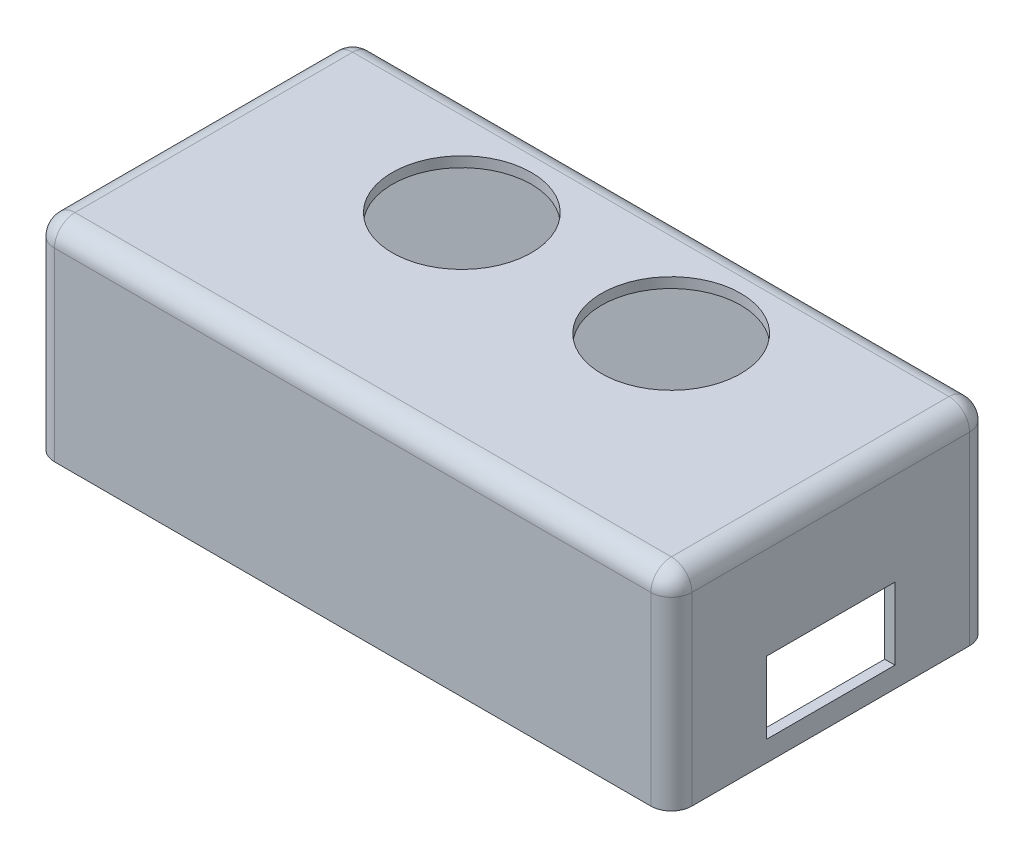
ISO-10303-21;
HEADER;
FILE_DESCRIPTION(('STEP AP214'),'2;1');
FILE_NAME('part.step','',(''),(''),'','','');
FILE_SCHEMA(('AUTOMOTIVE_DESIGN { 1 0 10303 214 1 1 1 1 }'));
ENDSEC;
DATA;
#1=APPLICATION_CONTEXT('core data for automotive mechanical design processes');
#2=APPLICATION_PROTOCOL_DEFINITION('international standard','automotive_design',2000,#1);
#3=PRODUCT_CONTEXT('',#1,'mechanical');
#4=PRODUCT('Part','Part','',(#3));
#5=PRODUCT_RELATED_PRODUCT_CATEGORY('part','',(#4));
#6=PRODUCT_DEFINITION_FORMATION('','',#4);
#7=PRODUCT_DEFINITION_CONTEXT('part definition',#1,'design');
#8=PRODUCT_DEFINITION('design','',#6,#7);
#9=PRODUCT_DEFINITION_SHAPE('','',#8);
#10=(LENGTH_UNIT() NAMED_UNIT(*) SI_UNIT(.MILLI.,.METRE.));
#11=(NAMED_UNIT(*) PLANE_ANGLE_UNIT() SI_UNIT($,.RADIAN.));
#12=(NAMED_UNIT(*) SI_UNIT($,.STERADIAN.) SOLID_ANGLE_UNIT());
#13=UNCERTAINTY_MEASURE_WITH_UNIT(LENGTH_MEASURE(1.E-05),#10,'distance_accuracy_value','');
#14=(GEOMETRIC_REPRESENTATION_CONTEXT(3) GLOBAL_UNCERTAINTY_ASSIGNED_CONTEXT((#13)) GLOBAL_UNIT_ASSIGNED_CONTEXT((#10,
#11,#12)) REPRESENTATION_CONTEXT('',''));
#15=CARTESIAN_POINT('',(0.,0.,0.));
#16=DIRECTION('',(0.,0.,1.));
#17=DIRECTION('',(1.,0.,0.));
#18=AXIS2_PLACEMENT_3D('',#15,#16,#17);
#19=CARTESIAN_POINT('',(0.,0.,0.));
#20=DIRECTION('',(0.,1.,0.));
#21=DIRECTION('',(0.,0.,1.));
#22=AXIS2_PLACEMENT_3D('',#19,#20,#21);
#23=PLANE('',#22);
#24=DIRECTION('',(0.,0.,1.));
#25=VECTOR('',#24,1.);
#26=CARTESIAN_POINT('',(-78.74,0.,0.));
#27=LINE('',#26,#25);
#28=CARTESIAN_POINT('',(-78.74,0.,-36.83));
#29=VERTEX_POINT('',#28);
#30=CARTESIAN_POINT('',(-78.74,0.,-2.53999999999999));
#31=VERTEX_POINT('',#30);
#32=EDGE_CURVE('E345',#29,#31,#27,.T.);
#33=ORIENTED_EDGE('',*,*,#32,.F.);
#34=CARTESIAN_POINT('',(-76.2,0.,-36.83));
#35=DIRECTION('',(0.,1.,0.));
#36=DIRECTION('',(0.,0.,1.));
#37=AXIS2_PLACEMENT_3D('',#34,#35,#36);
#38=CIRCLE('',#37,2.54);
#39=CARTESIAN_POINT('',(-76.2,0.,-39.37));
#40=VERTEX_POINT('',#39);
#41=EDGE_CURVE('E12',#29,#40,#38,.F.);
#42=ORIENTED_EDGE('',*,*,#41,.T.);
#43=DIRECTION('',(-1.,0.,0.));
#44=VECTOR('',#43,1.);
#45=CARTESIAN_POINT('',(0.,0.,-39.37));
#46=LINE('',#45,#44);
#47=CARTESIAN_POINT('',(-2.54,0.,-39.37));
#48=VERTEX_POINT('',#47);
#49=EDGE_CURVE('E342',#48,#40,#46,.T.);
#50=ORIENTED_EDGE('',*,*,#49,.F.);
#51=CARTESIAN_POINT('',(-2.54,0.,-36.83));
#52=DIRECTION('',(0.,1.,0.));
#53=DIRECTION('',(0.,0.,1.));
#54=AXIS2_PLACEMENT_3D('',#51,#52,#53);
#55=CIRCLE('',#54,2.54);
#56=CARTESIAN_POINT('',(0.,0.,-36.83));
#57=VERTEX_POINT('',#56);
#58=EDGE_CURVE('E385',#48,#57,#55,.F.);
#59=ORIENTED_EDGE('',*,*,#58,.T.);
#60=DIRECTION('',(0.,0.,-1.));
#61=VECTOR('',#60,1.);
#62=CARTESIAN_POINT('',(0.,0.,0.));
#63=LINE('',#62,#61);
#64=CARTESIAN_POINT('',(0.,0.,-2.54));
#65=VERTEX_POINT('',#64);
#66=EDGE_CURVE('E339',#65,#57,#63,.T.);
#67=ORIENTED_EDGE('',*,*,#66,.F.);
#68=CARTESIAN_POINT('',(-2.54,0.,-2.54));
#69=DIRECTION('',(0.,1.,0.));
#70=DIRECTION('',(0.,0.,1.));
#71=AXIS2_PLACEMENT_3D('',#68,#69,#70);
#72=CIRCLE('',#71,2.54);
#73=CARTESIAN_POINT('',(-2.54,0.,0.));
#74=VERTEX_POINT('',#73);
#75=EDGE_CURVE('E387',#65,#74,#72,.F.);
#76=ORIENTED_EDGE('',*,*,#75,.T.);
#77=DIRECTION('',(1.,0.,0.));
#78=VECTOR('',#77,1.);
#79=CARTESIAN_POINT('',(0.,0.,0.));
#80=LINE('',#79,#78);
#81=CARTESIAN_POINT('',(-76.2,0.,0.));
#82=VERTEX_POINT('',#81);
#83=EDGE_CURVE('E348',#82,#74,#80,.T.);
#84=ORIENTED_EDGE('',*,*,#83,.F.);
#85=CARTESIAN_POINT('',(-76.2,0.,-2.53999999999999));
#86=DIRECTION('',(0.,1.,0.));
#87=DIRECTION('',(0.,0.,1.));
#88=AXIS2_PLACEMENT_3D('',#85,#86,#87);
#89=CIRCLE('',#88,2.54);
#90=EDGE_CURVE('E47',#82,#31,#89,.F.);
#91=ORIENTED_EDGE('',*,*,#90,.T.);
#92=EDGE_LOOP('',(#33,#42,#50,#59,#67,#76,#84,#91));
#93=FACE_BOUND('',#92,.T.);
#94=CARTESIAN_POINT('',(-76.2,0.,-36.83));
#95=DIRECTION('',(0.,1.,0.));
#96=DIRECTION('',(0.,0.,1.));
#97=AXIS2_PLACEMENT_3D('',#94,#95,#96);
#98=CIRCLE('',#97,1.27);
#99=CARTESIAN_POINT('',(-77.47,0.,-36.83));
#100=VERTEX_POINT('',#99);
#101=CARTESIAN_POINT('',(-76.2,0.,-38.1));
#102=VERTEX_POINT('',#101);
#103=EDGE_CURVE('E331',#100,#102,#98,.F.);
#104=ORIENTED_EDGE('',*,*,#103,.F.);
#105=DIRECTION('',(0.,0.,1.));
#106=VECTOR('',#105,1.);
#107=CARTESIAN_POINT('',(-77.47,0.,0.));
#108=LINE('',#107,#106);
#109=CARTESIAN_POINT('',(-77.47,0.,-2.53999999999999));
#110=VERTEX_POINT('',#109);
#111=EDGE_CURVE('E329',#100,#110,#108,.T.);
#112=ORIENTED_EDGE('',*,*,#111,.T.);
#113=CARTESIAN_POINT('',(-76.2,0.,-2.53999999999999));
#114=DIRECTION('',(0.,1.,0.));
#115=DIRECTION('',(0.,0.,1.));
#116=AXIS2_PLACEMENT_3D('',#113,#114,#115);
#117=CIRCLE('',#116,1.27);
#118=CARTESIAN_POINT('',(-76.2,0.,-1.26999999999999));
#119=VERTEX_POINT('',#118);
#120=EDGE_CURVE('E326',#119,#110,#117,.F.);
#121=ORIENTED_EDGE('',*,*,#120,.F.);
#122=DIRECTION('',(1.,0.,0.));
#123=VECTOR('',#122,1.);
#124=CARTESIAN_POINT('',(0.,0.,-1.27));
#125=LINE('',#124,#123);
#126=CARTESIAN_POINT('',(-2.54,0.,-1.27));
#127=VERTEX_POINT('',#126);
#128=EDGE_CURVE('E294',#119,#127,#125,.T.);
#129=ORIENTED_EDGE('',*,*,#128,.T.);
#130=CARTESIAN_POINT('',(-2.54,0.,-2.54));
#131=DIRECTION('',(0.,1.,0.));
#132=DIRECTION('',(0.,0.,1.));
#133=AXIS2_PLACEMENT_3D('',#130,#131,#132);
#134=CIRCLE('',#133,1.27);
#135=CARTESIAN_POINT('',(-1.27,0.,-2.54));
#136=VERTEX_POINT('',#135);
#137=EDGE_CURVE('E324',#136,#127,#134,.F.);
#138=ORIENTED_EDGE('',*,*,#137,.F.);
#139=DIRECTION('',(0.,0.,-1.));
#140=VECTOR('',#139,1.);
#141=CARTESIAN_POINT('',(-1.27,0.,0.));
#142=LINE('',#141,#140);
#143=CARTESIAN_POINT('',(-1.27,0.,-36.83));
#144=VERTEX_POINT('',#143);
#145=EDGE_CURVE('E274',#136,#144,#142,.T.);
#146=ORIENTED_EDGE('',*,*,#145,.T.);
#147=CARTESIAN_POINT('',(-2.54,0.,-36.83));
#148=DIRECTION('',(0.,1.,0.));
#149=DIRECTION('',(0.,0.,1.));
#150=AXIS2_PLACEMENT_3D('',#147,#148,#149);
#151=CIRCLE('',#150,1.27);
#152=CARTESIAN_POINT('',(-2.54,0.,-38.1));
#153=VERTEX_POINT('',#152);
#154=EDGE_CURVE('E255',#153,#144,#151,.F.);
#155=ORIENTED_EDGE('',*,*,#154,.F.);
#156=DIRECTION('',(-1.,0.,0.));
#157=VECTOR('',#156,1.);
#158=CARTESIAN_POINT('',(0.,0.,-38.1));
#159=LINE('',#158,#157);
#160=EDGE_CURVE('E323',#153,#102,#159,.T.);
#161=ORIENTED_EDGE('',*,*,#160,.T.);
#162=EDGE_LOOP('',(#104,#112,#121,#129,#138,#146,#155,#161));
#163=FACE_BOUND('',#162,.T.);
#164=ADVANCED_FACE('F38',(#93,#163),#23,.F.);
#165=CARTESIAN_POINT('',(0.,25.4,0.));
#166=DIRECTION('',(-1.,0.,0.));
#167=DIRECTION('',(0.,0.,1.));
#168=AXIS2_PLACEMENT_3D('',#165,#166,#167);
#169=PLANE('',#168);
#170=DIRECTION('',(0.,1.,0.));
#171=VECTOR('',#170,1.);
#172=CARTESIAN_POINT('',(0.,2.54,-27.6225));
#173=LINE('',#172,#171);
#174=CARTESIAN_POINT('',(0.,2.54,-27.6225));
#175=VERTEX_POINT('',#174);
#176=CARTESIAN_POINT('',(0.,11.43,-27.6225));
#177=VERTEX_POINT('',#176);
#178=EDGE_CURVE('E224',#175,#177,#173,.T.);
#179=ORIENTED_EDGE('',*,*,#178,.F.);
#180=DIRECTION('',(0.,0.,-1.));
#181=VECTOR('',#180,1.);
#182=CARTESIAN_POINT('',(0.,2.54,-11.7475));
#183=LINE('',#182,#181);
#184=CARTESIAN_POINT('',(0.,2.54,-11.7475));
#185=VERTEX_POINT('',#184);
#186=EDGE_CURVE('E217',#185,#175,#183,.T.);
#187=ORIENTED_EDGE('',*,*,#186,.F.);
#188=DIRECTION('',(0.,-1.,0.));
#189=VECTOR('',#188,1.);
#190=CARTESIAN_POINT('',(0.,2.54,-11.7475));
#191=LINE('',#190,#189);
#192=CARTESIAN_POINT('',(0.,11.43,-11.7475));
#193=VERTEX_POINT('',#192);
#194=EDGE_CURVE('E228',#193,#185,#191,.T.);
#195=ORIENTED_EDGE('',*,*,#194,.F.);
#196=DIRECTION('',(0.,0.,1.));
#197=VECTOR('',#196,1.);
#198=CARTESIAN_POINT('',(0.,11.43,-11.7475));
#199=LINE('',#198,#197);
#200=EDGE_CURVE('E55',#177,#193,#199,.T.);
#201=ORIENTED_EDGE('',*,*,#200,.F.);
#202=EDGE_LOOP('',(#179,#187,#195,#201));
#203=FACE_BOUND('',#202,.T.);
#204=DIRECTION('',(0.,0.,-1.));
#205=VECTOR('',#204,1.);
#206=CARTESIAN_POINT('',(0.,22.86,0.));
#207=LINE('',#206,#205);
#208=CARTESIAN_POINT('',(0.,22.86,-36.83));
#209=VERTEX_POINT('',#208);
#210=CARTESIAN_POINT('',(0.,22.86,-2.54));
#211=VERTEX_POINT('',#210);
#212=EDGE_CURVE('E381',#209,#211,#207,.F.);
#213=ORIENTED_EDGE('',*,*,#212,.T.);
#214=DIRECTION('',(0.,-1.,0.));
#215=VECTOR('',#214,1.);
#216=CARTESIAN_POINT('',(0.,25.4,-2.54));
#217=LINE('',#216,#215);
#218=EDGE_CURVE('E383',#211,#65,#217,.T.);
#219=ORIENTED_EDGE('',*,*,#218,.T.);
#220=ORIENTED_EDGE('',*,*,#66,.T.);
#221=DIRECTION('',(0.,-1.,0.));
#222=VECTOR('',#221,1.);
#223=CARTESIAN_POINT('',(0.,25.4,-36.83));
#224=LINE('',#223,#222);
#225=EDGE_CURVE('E379',#57,#209,#224,.F.);
#226=ORIENTED_EDGE('',*,*,#225,.T.);
#227=EDGE_LOOP('',(#213,#219,#220,#226));
#228=FACE_BOUND('',#227,.T.);
#229=ADVANCED_FACE('F459',(#203,#228),#169,.F.);
#230=CARTESIAN_POINT('',(0.,25.4,-39.37));
#231=DIRECTION('',(0.,0.,1.));
#232=DIRECTION('',(1.,0.,0.));
#233=AXIS2_PLACEMENT_3D('',#230,#231,#232);
#234=PLANE('',#233);
#235=ORIENTED_EDGE('',*,*,#49,.T.);
#236=DIRECTION('',(0.,-1.,0.));
#237=VECTOR('',#236,1.);
#238=CARTESIAN_POINT('',(-76.2,25.4,-39.37));
#239=LINE('',#238,#237);
#240=CARTESIAN_POINT('',(-76.2,22.86,-39.37));
#241=VERTEX_POINT('',#240);
#242=EDGE_CURVE('E377',#40,#241,#239,.F.);
#243=ORIENTED_EDGE('',*,*,#242,.T.);
#244=DIRECTION('',(-1.,0.,0.));
#245=VECTOR('',#244,1.);
#246=CARTESIAN_POINT('',(0.,22.86,-39.37));
#247=LINE('',#246,#245);
#248=CARTESIAN_POINT('',(-2.54,22.86,-39.37));
#249=VERTEX_POINT('',#248);
#250=EDGE_CURVE('E375',#241,#249,#247,.F.);
#251=ORIENTED_EDGE('',*,*,#250,.T.);
#252=DIRECTION('',(0.,-1.,0.));
#253=VECTOR('',#252,1.);
#254=CARTESIAN_POINT('',(-2.54,25.4,-39.37));
#255=LINE('',#254,#253);
#256=EDGE_CURVE('E373',#249,#48,#255,.T.);
#257=ORIENTED_EDGE('',*,*,#256,.T.);
#258=EDGE_LOOP('',(#235,#243,#251,#257));
#259=FACE_BOUND('',#258,.T.);
#260=ADVANCED_FACE('F445',(#259),#234,.F.);
#261=CARTESIAN_POINT('',(-78.74,25.4,0.));
#262=DIRECTION('',(1.,0.,0.));
#263=DIRECTION('',(0.,0.,-1.));
#264=AXIS2_PLACEMENT_3D('',#261,#262,#263);
#265=PLANE('',#264);
#266=DIRECTION('',(0.,0.,1.));
#267=VECTOR('',#266,1.);
#268=CARTESIAN_POINT('',(-78.74,22.86,-39.37));
#269=LINE('',#268,#267);
#270=CARTESIAN_POINT('',(-78.74,22.86,-2.53999999999999));
#271=VERTEX_POINT('',#270);
#272=CARTESIAN_POINT('',(-78.74,22.86,-36.83));
#273=VERTEX_POINT('',#272);
#274=EDGE_CURVE('E369',#271,#273,#269,.F.);
#275=ORIENTED_EDGE('',*,*,#274,.T.);
#276=DIRECTION('',(0.,-1.,0.));
#277=VECTOR('',#276,1.);
#278=CARTESIAN_POINT('',(-78.74,25.4,-36.83));
#279=LINE('',#278,#277);
#280=EDGE_CURVE('E371',#273,#29,#279,.T.);
#281=ORIENTED_EDGE('',*,*,#280,.T.);
#282=ORIENTED_EDGE('',*,*,#32,.T.);
#283=DIRECTION('',(0.,-1.,0.));
#284=VECTOR('',#283,1.);
#285=CARTESIAN_POINT('',(-78.74,25.4,-2.53999999999999));
#286=LINE('',#285,#284);
#287=EDGE_CURVE('E367',#31,#271,#286,.F.);
#288=ORIENTED_EDGE('',*,*,#287,.T.);
#289=EDGE_LOOP('',(#275,#281,#282,#288));
#290=FACE_BOUND('',#289,.T.);
#291=ADVANCED_FACE('F484',(#290),#265,.F.);
#292=CARTESIAN_POINT('',(0.,25.4,0.));
#293=DIRECTION('',(0.,0.,-1.));
#294=DIRECTION('',(-1.,0.,0.));
#295=AXIS2_PLACEMENT_3D('',#292,#293,#294);
#296=PLANE('',#295);
#297=DIRECTION('',(1.,0.,0.));
#298=VECTOR('',#297,1.);
#299=CARTESIAN_POINT('',(-78.74,22.86,0.));
#300=LINE('',#299,#298);
#301=CARTESIAN_POINT('',(-2.54,22.86,0.));
#302=VERTEX_POINT('',#301);
#303=CARTESIAN_POINT('',(-76.2,22.86,0.));
#304=VERTEX_POINT('',#303);
#305=EDGE_CURVE('E362',#302,#304,#300,.F.);
#306=ORIENTED_EDGE('',*,*,#305,.T.);
#307=DIRECTION('',(0.,-1.,0.));
#308=VECTOR('',#307,1.);
#309=CARTESIAN_POINT('',(-76.2,25.4,0.));
#310=LINE('',#309,#308);
#311=EDGE_CURVE('E365',#304,#82,#310,.T.);
#312=ORIENTED_EDGE('',*,*,#311,.T.);
#313=ORIENTED_EDGE('',*,*,#83,.T.);
#314=DIRECTION('',(0.,-1.,0.));
#315=VECTOR('',#314,1.);
#316=CARTESIAN_POINT('',(-2.54,25.4,0.));
#317=LINE('',#316,#315);
#318=EDGE_CURVE('E360',#74,#302,#317,.F.);
#319=ORIENTED_EDGE('',*,*,#318,.T.);
#320=EDGE_LOOP('',(#306,#312,#313,#319));
#321=FACE_BOUND('',#320,.T.);
#322=ADVANCED_FACE('F476',(#321),#296,.F.);
#323=CARTESIAN_POINT('',(0.,25.4,0.));
#324=DIRECTION('',(0.,1.,0.));
#325=DIRECTION('',(0.,0.,1.));
#326=AXIS2_PLACEMENT_3D('',#323,#324,#325);
#327=PLANE('',#326);
#328=CARTESIAN_POINT('',(-26.4414,25.4,-26.416));
#329=DIRECTION('',(0.,-1.,0.));
#330=DIRECTION('',(0.,0.,-1.));
#331=AXIS2_PLACEMENT_3D('',#328,#329,#330);
#332=CIRCLE('',#331,8.5979);
#333=CARTESIAN_POINT('',(-26.4414,25.4,-35.0139));
#334=VERTEX_POINT('',#333);
#335=EDGE_CURVE('E238',#334,#334,#332,.T.);
#336=ORIENTED_EDGE('',*,*,#335,.T.);
#337=EDGE_LOOP('',(#336));
#338=FACE_BOUND('',#337,.T.);
#339=CARTESIAN_POINT('',(-52.2986,25.4,-26.416));
#340=DIRECTION('',(0.,-1.,0.));
#341=DIRECTION('',(0.,0.,-1.));
#342=AXIS2_PLACEMENT_3D('',#339,#340,#341);
#343=CIRCLE('',#342,8.59790000000001);
#344=CARTESIAN_POINT('',(-52.2986,25.4,-35.0139));
#345=VERTEX_POINT('',#344);
#346=EDGE_CURVE('E244',#345,#345,#343,.T.);
#347=ORIENTED_EDGE('',*,*,#346,.T.);
#348=EDGE_LOOP('',(#347));
#349=FACE_BOUND('',#348,.T.);
#350=DIRECTION('',(0.,0.,1.));
#351=VECTOR('',#350,1.);
#352=CARTESIAN_POINT('',(-76.2,25.4,0.));
#353=LINE('',#352,#351);
#354=CARTESIAN_POINT('',(-76.2,25.4,-36.83));
#355=VERTEX_POINT('',#354);
#356=CARTESIAN_POINT('',(-76.2,25.4,-2.53999999999999));
#357=VERTEX_POINT('',#356);
#358=EDGE_CURVE('E355',#355,#357,#353,.T.);
#359=ORIENTED_EDGE('',*,*,#358,.T.);
#360=DIRECTION('',(1.,0.,0.));
#361=VECTOR('',#360,1.);
#362=CARTESIAN_POINT('',(0.,25.4,-2.54));
#363=LINE('',#362,#361);
#364=CARTESIAN_POINT('',(-2.54,25.4,-2.54));
#365=VERTEX_POINT('',#364);
#366=EDGE_CURVE('E357',#357,#365,#363,.T.);
#367=ORIENTED_EDGE('',*,*,#366,.T.);
#368=DIRECTION('',(0.,0.,-1.));
#369=VECTOR('',#368,1.);
#370=CARTESIAN_POINT('',(-2.54,25.4,-39.37));
#371=LINE('',#370,#369);
#372=CARTESIAN_POINT('',(-2.54,25.4,-36.83));
#373=VERTEX_POINT('',#372);
#374=EDGE_CURVE('E351',#365,#373,#371,.T.);
#375=ORIENTED_EDGE('',*,*,#374,.T.);
#376=DIRECTION('',(-1.,0.,0.));
#377=VECTOR('',#376,1.);
#378=CARTESIAN_POINT('',(-78.74,25.4,-36.83));
#379=LINE('',#378,#377);
#380=EDGE_CURVE('E353',#373,#355,#379,.T.);
#381=ORIENTED_EDGE('',*,*,#380,.T.);
#382=EDGE_LOOP('',(#359,#367,#375,#381));
#383=FACE_BOUND('',#382,.T.);
#384=ADVANCED_FACE('F435',(#338,#349,#383),#327,.T.);
#385=CARTESIAN_POINT('',(-76.2,25.4,-36.83));
#386=DIRECTION('',(0.,-1.,0.));
#387=DIRECTION('',(0.,0.,-1.));
#388=AXIS2_PLACEMENT_3D('',#385,#386,#387);
#389=CYLINDRICAL_SURFACE('',#388,2.54);
#390=ORIENTED_EDGE('',*,*,#41,.F.);
#391=ORIENTED_EDGE('',*,*,#280,.F.);
#392=CARTESIAN_POINT('',(-76.2,22.86,-36.83));
#393=DIRECTION('',(0.,1.,0.));
#394=DIRECTION('',(0.,0.,1.));
#395=AXIS2_PLACEMENT_3D('',#392,#393,#394);
#396=CIRCLE('',#395,2.54);
#397=EDGE_CURVE('E42',#241,#273,#396,.T.);
#398=ORIENTED_EDGE('',*,*,#397,.F.);
#399=ORIENTED_EDGE('',*,*,#242,.F.);
#400=EDGE_LOOP('',(#390,#391,#398,#399));
#401=FACE_BOUND('',#400,.T.);
#402=ADVANCED_FACE('F40',(#401),#389,.T.);
#403=CARTESIAN_POINT('',(0.,22.86,-36.83));
#404=DIRECTION('',(1.,0.,0.));
#405=DIRECTION('',(0.,0.,-1.));
#406=AXIS2_PLACEMENT_3D('',#403,#404,#405);
#407=CYLINDRICAL_SURFACE('',#406,2.54);
#408=CARTESIAN_POINT('',(-2.54,22.86,-36.83));
#409=DIRECTION('',(1.,0.,0.));
#410=DIRECTION('',(0.,0.,-1.));
#411=AXIS2_PLACEMENT_3D('',#408,#409,#410);
#412=CIRCLE('',#411,2.54);
#413=EDGE_CURVE('E414',#249,#373,#412,.T.);
#414=ORIENTED_EDGE('',*,*,#413,.F.);
#415=ORIENTED_EDGE('',*,*,#250,.F.);
#416=CARTESIAN_POINT('',(-76.2,22.86,-36.83));
#417=DIRECTION('',(-1.,0.,0.));
#418=DIRECTION('',(0.,0.,1.));
#419=AXIS2_PLACEMENT_3D('',#416,#417,#418);
#420=CIRCLE('',#419,2.54);
#421=EDGE_CURVE('E416',#355,#241,#420,.T.);
#422=ORIENTED_EDGE('',*,*,#421,.F.);
#423=ORIENTED_EDGE('',*,*,#380,.F.);
#424=EDGE_LOOP('',(#414,#415,#422,#423));
#425=FACE_BOUND('',#424,.T.);
#426=ADVANCED_FACE('F442',(#425),#407,.T.);
#427=CARTESIAN_POINT('',(-2.54,25.4,-36.83));
#428=DIRECTION('',(0.,-1.,0.));
#429=DIRECTION('',(0.,0.,-1.));
#430=AXIS2_PLACEMENT_3D('',#427,#428,#429);
#431=CYLINDRICAL_SURFACE('',#430,2.54);
#432=ORIENTED_EDGE('',*,*,#58,.F.);
#433=ORIENTED_EDGE('',*,*,#256,.F.);
#434=CARTESIAN_POINT('',(-2.54,22.86,-36.83));
#435=DIRECTION('',(0.,1.,0.));
#436=DIRECTION('',(0.,0.,1.));
#437=AXIS2_PLACEMENT_3D('',#434,#435,#436);
#438=CIRCLE('',#437,2.54);
#439=EDGE_CURVE('E411',#209,#249,#438,.T.);
#440=ORIENTED_EDGE('',*,*,#439,.F.);
#441=ORIENTED_EDGE('',*,*,#225,.F.);
#442=EDGE_LOOP('',(#432,#433,#440,#441));
#443=FACE_BOUND('',#442,.T.);
#444=ADVANCED_FACE('F450',(#443),#431,.T.);
#445=CARTESIAN_POINT('',(-76.2,22.86,-36.83));
#446=DIRECTION('',(0.,0.,1.));
#447=DIRECTION('',(1.,0.,0.));
#448=AXIS2_PLACEMENT_3D('',#445,#446,#447);
#449=SPHERICAL_SURFACE('',#448,2.54);
#450=ORIENTED_EDGE('',*,*,#421,.T.);
#451=ORIENTED_EDGE('',*,*,#397,.T.);
#452=CARTESIAN_POINT('',(-76.2,22.86,-36.83));
#453=DIRECTION('',(0.,0.,-1.));
#454=DIRECTION('',(-1.,0.,0.));
#455=AXIS2_PLACEMENT_3D('',#452,#453,#454);
#456=CIRCLE('',#455,2.54);
#457=EDGE_CURVE('E408',#355,#273,#456,.F.);
#458=ORIENTED_EDGE('',*,*,#457,.F.);
#459=EDGE_LOOP('',(#450,#451,#458));
#460=FACE_BOUND('',#459,.T.);
#461=ADVANCED_FACE('F423',(#460),#449,.T.);
#462=CARTESIAN_POINT('',(-2.54,22.86,-36.83));
#463=DIRECTION('',(0.,0.,1.));
#464=DIRECTION('',(1.,0.,0.));
#465=AXIS2_PLACEMENT_3D('',#462,#463,#464);
#466=SPHERICAL_SURFACE('',#465,2.54);
#467=ORIENTED_EDGE('',*,*,#439,.T.);
#468=ORIENTED_EDGE('',*,*,#413,.T.);
#469=CARTESIAN_POINT('',(-2.54,22.86,-36.83));
#470=DIRECTION('',(0.,0.,-1.));
#471=DIRECTION('',(-1.,0.,0.));
#472=AXIS2_PLACEMENT_3D('',#469,#470,#471);
#473=CIRCLE('',#472,2.54);
#474=EDGE_CURVE('E405',#209,#373,#473,.F.);
#475=ORIENTED_EDGE('',*,*,#474,.F.);
#476=EDGE_LOOP('',(#467,#468,#475));
#477=FACE_BOUND('',#476,.T.);
#478=ADVANCED_FACE('F524',(#477),#466,.T.);
#479=CARTESIAN_POINT('',(-76.2,25.4,-2.53999999999999));
#480=DIRECTION('',(0.,-1.,0.));
#481=DIRECTION('',(0.,0.,-1.));
#482=AXIS2_PLACEMENT_3D('',#479,#480,#481);
#483=CYLINDRICAL_SURFACE('',#482,2.54);
#484=ORIENTED_EDGE('',*,*,#90,.F.);
#485=ORIENTED_EDGE('',*,*,#311,.F.);
#486=CARTESIAN_POINT('',(-76.2,22.86,-2.53999999999999));
#487=DIRECTION('',(0.,1.,0.));
#488=DIRECTION('',(0.,0.,1.));
#489=AXIS2_PLACEMENT_3D('',#486,#487,#488);
#490=CIRCLE('',#489,2.54);
#491=EDGE_CURVE('E402',#271,#304,#490,.T.);
#492=ORIENTED_EDGE('',*,*,#491,.F.);
#493=ORIENTED_EDGE('',*,*,#287,.F.);
#494=EDGE_LOOP('',(#484,#485,#492,#493));
#495=FACE_BOUND('',#494,.T.);
#496=ADVANCED_FACE('F482',(#495),#483,.T.);
#497=CARTESIAN_POINT('',(-76.2,22.86,0.));
#498=DIRECTION('',(0.,0.,-1.));
#499=DIRECTION('',(-1.,0.,0.));
#500=AXIS2_PLACEMENT_3D('',#497,#498,#499);
#501=CYLINDRICAL_SURFACE('',#500,2.54);
#502=ORIENTED_EDGE('',*,*,#457,.T.);
#503=ORIENTED_EDGE('',*,*,#274,.F.);
#504=CARTESIAN_POINT('',(-76.2,22.86,-2.53999999999999));
#505=DIRECTION('',(0.,0.,1.));
#506=DIRECTION('',(1.,0.,0.));
#507=AXIS2_PLACEMENT_3D('',#504,#505,#506);
#508=CIRCLE('',#507,2.54);
#509=EDGE_CURVE('E399',#357,#271,#508,.T.);
#510=ORIENTED_EDGE('',*,*,#509,.F.);
#511=ORIENTED_EDGE('',*,*,#358,.F.);
#512=EDGE_LOOP('',(#502,#503,#510,#511));
#513=FACE_BOUND('',#512,.T.);
#514=ADVANCED_FACE('F430',(#513),#501,.T.);
#515=CARTESIAN_POINT('',(-2.54,22.86,0.));
#516=DIRECTION('',(0.,0.,1.));
#517=DIRECTION('',(1.,0.,0.));
#518=AXIS2_PLACEMENT_3D('',#515,#516,#517);
#519=CYLINDRICAL_SURFACE('',#518,2.54);
#520=ORIENTED_EDGE('',*,*,#474,.T.);
#521=ORIENTED_EDGE('',*,*,#374,.F.);
#522=CARTESIAN_POINT('',(-2.54,22.86,-2.54));
#523=DIRECTION('',(0.,0.,1.));
#524=DIRECTION('',(1.,0.,0.));
#525=AXIS2_PLACEMENT_3D('',#522,#523,#524);
#526=CIRCLE('',#525,2.54);
#527=EDGE_CURVE('E396',#211,#365,#526,.T.);
#528=ORIENTED_EDGE('',*,*,#527,.F.);
#529=ORIENTED_EDGE('',*,*,#212,.F.);
#530=EDGE_LOOP('',(#520,#521,#528,#529));
#531=FACE_BOUND('',#530,.T.);
#532=ADVANCED_FACE('F469',(#531),#519,.T.);
#533=CARTESIAN_POINT('',(-2.54,25.4,-2.54));
#534=DIRECTION('',(0.,-1.,0.));
#535=DIRECTION('',(0.,0.,-1.));
#536=AXIS2_PLACEMENT_3D('',#533,#534,#535);
#537=CYLINDRICAL_SURFACE('',#536,2.54);
#538=ORIENTED_EDGE('',*,*,#75,.F.);
#539=ORIENTED_EDGE('',*,*,#218,.F.);
#540=CARTESIAN_POINT('',(-2.54,22.86,-2.54));
#541=DIRECTION('',(0.,1.,0.));
#542=DIRECTION('',(0.,0.,1.));
#543=AXIS2_PLACEMENT_3D('',#540,#541,#542);
#544=CIRCLE('',#543,2.54);
#545=EDGE_CURVE('E393',#302,#211,#544,.T.);
#546=ORIENTED_EDGE('',*,*,#545,.F.);
#547=ORIENTED_EDGE('',*,*,#318,.F.);
#548=EDGE_LOOP('',(#538,#539,#546,#547));
#549=FACE_BOUND('',#548,.T.);
#550=ADVANCED_FACE('F465',(#549),#537,.T.);
#551=CARTESIAN_POINT('',(-76.2,22.86,-2.53999999999999));
#552=DIRECTION('',(0.,0.,1.));
#553=DIRECTION('',(1.,0.,0.));
#554=AXIS2_PLACEMENT_3D('',#551,#552,#553);
#555=SPHERICAL_SURFACE('',#554,2.54);
#556=ORIENTED_EDGE('',*,*,#509,.T.);
#557=ORIENTED_EDGE('',*,*,#491,.T.);
#558=CARTESIAN_POINT('',(-76.2,22.86,-2.53999999999999));
#559=DIRECTION('',(-1.,0.,0.));
#560=DIRECTION('',(0.,0.,1.));
#561=AXIS2_PLACEMENT_3D('',#558,#559,#560);
#562=CIRCLE('',#561,2.54);
#563=EDGE_CURVE('E391',#357,#304,#562,.F.);
#564=ORIENTED_EDGE('',*,*,#563,.F.);
#565=EDGE_LOOP('',(#556,#557,#564));
#566=FACE_BOUND('',#565,.T.);
#567=ADVANCED_FACE('F512',(#566),#555,.T.);
#568=CARTESIAN_POINT('',(-2.54,22.86,-2.54));
#569=DIRECTION('',(0.,0.,1.));
#570=DIRECTION('',(1.,0.,0.));
#571=AXIS2_PLACEMENT_3D('',#568,#569,#570);
#572=SPHERICAL_SURFACE('',#571,2.54);
#573=ORIENTED_EDGE('',*,*,#545,.T.);
#574=ORIENTED_EDGE('',*,*,#527,.T.);
#575=CARTESIAN_POINT('',(-2.54,22.86,-2.54));
#576=DIRECTION('',(1.,0.,0.));
#577=DIRECTION('',(0.,0.,-1.));
#578=AXIS2_PLACEMENT_3D('',#575,#576,#577);
#579=CIRCLE('',#578,2.54);
#580=EDGE_CURVE('E335',#302,#365,#579,.F.);
#581=ORIENTED_EDGE('',*,*,#580,.F.);
#582=EDGE_LOOP('',(#573,#574,#581));
#583=FACE_BOUND('',#582,.T.);
#584=ADVANCED_FACE('F472',(#583),#572,.T.);
#585=CARTESIAN_POINT('',(0.,22.86,-2.54));
#586=DIRECTION('',(-1.,0.,0.));
#587=DIRECTION('',(0.,0.,1.));
#588=AXIS2_PLACEMENT_3D('',#585,#586,#587);
#589=CYLINDRICAL_SURFACE('',#588,2.54);
#590=ORIENTED_EDGE('',*,*,#563,.T.);
#591=ORIENTED_EDGE('',*,*,#305,.F.);
#592=ORIENTED_EDGE('',*,*,#580,.T.);
#593=ORIENTED_EDGE('',*,*,#366,.F.);
#594=EDGE_LOOP('',(#590,#591,#592,#593));
#595=FACE_BOUND('',#594,.T.);
#596=ADVANCED_FACE('F474',(#595),#589,.T.);
#597=CARTESIAN_POINT('',(-1.27,25.4,0.));
#598=DIRECTION('',(-1.,0.,0.));
#599=DIRECTION('',(0.,0.,1.));
#600=AXIS2_PLACEMENT_3D('',#597,#598,#599);
#601=PLANE('',#600);
#602=DIRECTION('',(0.,0.,-1.));
#603=VECTOR('',#602,1.);
#604=CARTESIAN_POINT('',(-1.27,2.54,-11.7475));
#605=LINE('',#604,#603);
#606=CARTESIAN_POINT('',(-1.27,2.54,-11.7475));
#607=VERTEX_POINT('',#606);
#608=CARTESIAN_POINT('',(-1.27,2.54,-27.6225));
#609=VERTEX_POINT('',#608);
#610=EDGE_CURVE('E214',#607,#609,#605,.T.);
#611=ORIENTED_EDGE('',*,*,#610,.T.);
#612=DIRECTION('',(0.,1.,0.));
#613=VECTOR('',#612,1.);
#614=CARTESIAN_POINT('',(-1.27,2.54,-27.6225));
#615=LINE('',#614,#613);
#616=CARTESIAN_POINT('',(-1.27,11.43,-27.6225));
#617=VERTEX_POINT('',#616);
#618=EDGE_CURVE('E201',#609,#617,#615,.T.);
#619=ORIENTED_EDGE('',*,*,#618,.T.);
#620=DIRECTION('',(0.,0.,1.));
#621=VECTOR('',#620,1.);
#622=CARTESIAN_POINT('',(-1.27,11.43,-11.7475));
#623=LINE('',#622,#621);
#624=CARTESIAN_POINT('',(-1.27,11.43,-11.7475));
#625=VERTEX_POINT('',#624);
#626=EDGE_CURVE('E232',#617,#625,#623,.T.);
#627=ORIENTED_EDGE('',*,*,#626,.T.);
#628=DIRECTION('',(0.,-1.,0.));
#629=VECTOR('',#628,1.);
#630=CARTESIAN_POINT('',(-1.27,2.54,-11.7475));
#631=LINE('',#630,#629);
#632=EDGE_CURVE('E222',#625,#607,#631,.T.);
#633=ORIENTED_EDGE('',*,*,#632,.T.);
#634=EDGE_LOOP('',(#611,#619,#627,#633));
#635=FACE_BOUND('',#634,.T.);
#636=DIRECTION('',(0.,0.,1.));
#637=VECTOR('',#636,1.);
#638=CARTESIAN_POINT('',(-1.27,22.86,0.));
#639=LINE('',#638,#637);
#640=CARTESIAN_POINT('',(-1.27,22.86,-36.83));
#641=VERTEX_POINT('',#640);
#642=CARTESIAN_POINT('',(-1.27,22.86,-2.54));
#643=VERTEX_POINT('',#642);
#644=EDGE_CURVE('E250',#641,#643,#639,.T.);
#645=ORIENTED_EDGE('',*,*,#644,.F.);
#646=DIRECTION('',(0.,1.,0.));
#647=VECTOR('',#646,1.);
#648=CARTESIAN_POINT('',(-1.27,25.4,-36.83));
#649=LINE('',#648,#647);
#650=EDGE_CURVE('E253',#144,#641,#649,.T.);
#651=ORIENTED_EDGE('',*,*,#650,.F.);
#652=ORIENTED_EDGE('',*,*,#145,.F.);
#653=DIRECTION('',(0.,1.,0.));
#654=VECTOR('',#653,1.);
#655=CARTESIAN_POINT('',(-1.27,25.4,-2.54));
#656=LINE('',#655,#654);
#657=EDGE_CURVE('E252',#643,#136,#656,.F.);
#658=ORIENTED_EDGE('',*,*,#657,.F.);
#659=EDGE_LOOP('',(#645,#651,#652,#658));
#660=FACE_BOUND('',#659,.T.);
#661=ADVANCED_FACE('F220',(#635,#660),#601,.T.);
#662=CARTESIAN_POINT('',(0.,25.4,-38.1));
#663=DIRECTION('',(0.,0.,1.));
#664=DIRECTION('',(1.,0.,0.));
#665=AXIS2_PLACEMENT_3D('',#662,#663,#664);
#666=PLANE('',#665);
#667=ORIENTED_EDGE('',*,*,#160,.F.);
#668=DIRECTION('',(0.,1.,0.));
#669=VECTOR('',#668,1.);
#670=CARTESIAN_POINT('',(-2.54,25.4,-38.1));
#671=LINE('',#670,#669);
#672=CARTESIAN_POINT('',(-2.54,22.86,-38.1));
#673=VERTEX_POINT('',#672);
#674=EDGE_CURVE('E258',#673,#153,#671,.F.);
#675=ORIENTED_EDGE('',*,*,#674,.F.);
#676=DIRECTION('',(1.,0.,0.));
#677=VECTOR('',#676,1.);
#678=CARTESIAN_POINT('',(0.,22.86,-38.1));
#679=LINE('',#678,#677);
#680=CARTESIAN_POINT('',(-76.2,22.86,-38.1));
#681=VERTEX_POINT('',#680);
#682=EDGE_CURVE('E260',#681,#673,#679,.T.);
#683=ORIENTED_EDGE('',*,*,#682,.F.);
#684=DIRECTION('',(0.,1.,0.));
#685=VECTOR('',#684,1.);
#686=CARTESIAN_POINT('',(-76.2,25.4,-38.1));
#687=LINE('',#686,#685);
#688=EDGE_CURVE('E257',#102,#681,#687,.T.);
#689=ORIENTED_EDGE('',*,*,#688,.F.);
#690=EDGE_LOOP('',(#667,#675,#683,#689));
#691=FACE_BOUND('',#690,.T.);
#692=ADVANCED_FACE('F577',(#691),#666,.T.);
#693=CARTESIAN_POINT('',(-77.47,25.4,0.));
#694=DIRECTION('',(1.,0.,0.));
#695=DIRECTION('',(0.,0.,-1.));
#696=AXIS2_PLACEMENT_3D('',#693,#694,#695);
#697=PLANE('',#696);
#698=DIRECTION('',(0.,0.,-1.));
#699=VECTOR('',#698,1.);
#700=CARTESIAN_POINT('',(-77.47,22.86,0.));
#701=LINE('',#700,#699);
#702=CARTESIAN_POINT('',(-77.47,22.86,-2.53999999999999));
#703=VERTEX_POINT('',#702);
#704=CARTESIAN_POINT('',(-77.47,22.86,-36.83));
#705=VERTEX_POINT('',#704);
#706=EDGE_CURVE('E270',#703,#705,#701,.T.);
#707=ORIENTED_EDGE('',*,*,#706,.F.);
#708=DIRECTION('',(0.,1.,0.));
#709=VECTOR('',#708,1.);
#710=CARTESIAN_POINT('',(-77.47,25.4,-2.53999999999999));
#711=LINE('',#710,#709);
#712=EDGE_CURVE('E277',#110,#703,#711,.T.);
#713=ORIENTED_EDGE('',*,*,#712,.F.);
#714=ORIENTED_EDGE('',*,*,#111,.F.);
#715=DIRECTION('',(0.,1.,0.));
#716=VECTOR('',#715,1.);
#717=CARTESIAN_POINT('',(-77.47,25.4,-36.83));
#718=LINE('',#717,#716);
#719=EDGE_CURVE('E261',#705,#100,#718,.F.);
#720=ORIENTED_EDGE('',*,*,#719,.F.);
#721=EDGE_LOOP('',(#707,#713,#714,#720));
#722=FACE_BOUND('',#721,.T.);
#723=ADVANCED_FACE('F586',(#722),#697,.T.);
#724=CARTESIAN_POINT('',(0.,25.4,-1.27));
#725=DIRECTION('',(0.,0.,-1.));
#726=DIRECTION('',(-1.,0.,0.));
#727=AXIS2_PLACEMENT_3D('',#724,#725,#726);
#728=PLANE('',#727);
#729=DIRECTION('',(-1.,0.,0.));
#730=VECTOR('',#729,1.);
#731=CARTESIAN_POINT('',(0.,22.86,-1.27));
#732=LINE('',#731,#730);
#733=CARTESIAN_POINT('',(-2.54,22.86,-1.27));
#734=VERTEX_POINT('',#733);
#735=CARTESIAN_POINT('',(-76.2,22.86,-1.26999999999999));
#736=VERTEX_POINT('',#735);
#737=EDGE_CURVE('E310',#734,#736,#732,.T.);
#738=ORIENTED_EDGE('',*,*,#737,.F.);
#739=DIRECTION('',(0.,1.,0.));
#740=VECTOR('',#739,1.);
#741=CARTESIAN_POINT('',(-2.54,25.4,-1.27));
#742=LINE('',#741,#740);
#743=EDGE_CURVE('E291',#127,#734,#742,.T.);
#744=ORIENTED_EDGE('',*,*,#743,.F.);
#745=ORIENTED_EDGE('',*,*,#128,.F.);
#746=DIRECTION('',(0.,1.,0.));
#747=VECTOR('',#746,1.);
#748=CARTESIAN_POINT('',(-76.2,25.4,-1.26999999999999));
#749=LINE('',#748,#747);
#750=EDGE_CURVE('E279',#736,#119,#749,.F.);
#751=ORIENTED_EDGE('',*,*,#750,.F.);
#752=EDGE_LOOP('',(#738,#744,#745,#751));
#753=FACE_BOUND('',#752,.T.);
#754=ADVANCED_FACE('F594',(#753),#728,.T.);
#755=CARTESIAN_POINT('',(0.,24.13,0.));
#756=DIRECTION('',(0.,1.,0.));
#757=DIRECTION('',(0.,0.,1.));
#758=AXIS2_PLACEMENT_3D('',#755,#756,#757);
#759=PLANE('',#758);
#760=CARTESIAN_POINT('',(-26.4414,24.13,-26.416));
#761=DIRECTION('',(0.,-1.,0.));
#762=DIRECTION('',(0.,0.,-1.));
#763=AXIS2_PLACEMENT_3D('',#760,#761,#762);
#764=CIRCLE('',#763,8.5979);
#765=CARTESIAN_POINT('',(-26.4414,24.13,-35.0139));
#766=VERTEX_POINT('',#765);
#767=EDGE_CURVE('E237',#766,#766,#764,.T.);
#768=ORIENTED_EDGE('',*,*,#767,.F.);
#769=EDGE_LOOP('',(#768));
#770=FACE_BOUND('',#769,.T.);
#771=CARTESIAN_POINT('',(-52.2986,24.13,-26.416));
#772=DIRECTION('',(0.,-1.,0.));
#773=DIRECTION('',(0.,0.,-1.));
#774=AXIS2_PLACEMENT_3D('',#771,#772,#773);
#775=CIRCLE('',#774,8.59790000000001);
#776=CARTESIAN_POINT('',(-52.2986,24.13,-35.0139));
#777=VERTEX_POINT('',#776);
#778=EDGE_CURVE('E241',#777,#777,#775,.T.);
#779=ORIENTED_EDGE('',*,*,#778,.F.);
#780=EDGE_LOOP('',(#779));
#781=FACE_BOUND('',#780,.T.);
#782=DIRECTION('',(0.,0.,1.));
#783=VECTOR('',#782,1.);
#784=CARTESIAN_POINT('',(-76.2,24.13,0.));
#785=LINE('',#784,#783);
#786=CARTESIAN_POINT('',(-76.2,24.13,-36.83));
#787=VERTEX_POINT('',#786);
#788=CARTESIAN_POINT('',(-76.2,24.13,-2.53999999999999));
#789=VERTEX_POINT('',#788);
#790=EDGE_CURVE('E285',#787,#789,#785,.T.);
#791=ORIENTED_EDGE('',*,*,#790,.F.);
#792=DIRECTION('',(1.,0.,0.));
#793=VECTOR('',#792,1.);
#794=CARTESIAN_POINT('',(0.,24.13,-36.83));
#795=LINE('',#794,#793);
#796=CARTESIAN_POINT('',(-2.54,24.13,-36.83));
#797=VERTEX_POINT('',#796);
#798=EDGE_CURVE('E288',#797,#787,#795,.F.);
#799=ORIENTED_EDGE('',*,*,#798,.F.);
#800=DIRECTION('',(0.,0.,1.));
#801=VECTOR('',#800,1.);
#802=CARTESIAN_POINT('',(-2.54,24.13,0.));
#803=LINE('',#802,#801);
#804=CARTESIAN_POINT('',(-2.54,24.13,-2.54));
#805=VERTEX_POINT('',#804);
#806=EDGE_CURVE('E292',#805,#797,#803,.F.);
#807=ORIENTED_EDGE('',*,*,#806,.F.);
#808=DIRECTION('',(1.,0.,0.));
#809=VECTOR('',#808,1.);
#810=CARTESIAN_POINT('',(0.,24.13,-2.53999999999999));
#811=LINE('',#810,#809);
#812=EDGE_CURVE('E287',#789,#805,#811,.T.);
#813=ORIENTED_EDGE('',*,*,#812,.F.);
#814=EDGE_LOOP('',(#791,#799,#807,#813));
#815=FACE_BOUND('',#814,.T.);
#816=ADVANCED_FACE('F602',(#770,#781,#815),#759,.F.);
#817=CARTESIAN_POINT('',(-76.2,25.4,-36.83));
#818=DIRECTION('',(0.,-1.,0.));
#819=DIRECTION('',(0.,0.,-1.));
#820=AXIS2_PLACEMENT_3D('',#817,#818,#819);
#821=CYLINDRICAL_SURFACE('',#820,1.27);
#822=ORIENTED_EDGE('',*,*,#103,.T.);
#823=ORIENTED_EDGE('',*,*,#688,.T.);
#824=CARTESIAN_POINT('',(-76.2,22.86,-36.83));
#825=DIRECTION('',(0.,1.,0.));
#826=DIRECTION('',(-1.,0.,0.));
#827=AXIS2_PLACEMENT_3D('',#824,#825,#826);
#828=CIRCLE('',#827,1.27);
#829=EDGE_CURVE('E271',#681,#705,#828,.T.);
#830=ORIENTED_EDGE('',*,*,#829,.T.);
#831=ORIENTED_EDGE('',*,*,#719,.T.);
#832=EDGE_LOOP('',(#822,#823,#830,#831));
#833=FACE_BOUND('',#832,.T.);
#834=ADVANCED_FACE('F611',(#833),#821,.F.);
#835=CARTESIAN_POINT('',(0.,22.86,-36.83));
#836=DIRECTION('',(1.,0.,0.));
#837=DIRECTION('',(0.,0.,-1.));
#838=AXIS2_PLACEMENT_3D('',#835,#836,#837);
#839=CYLINDRICAL_SURFACE('',#838,1.27);
#840=CARTESIAN_POINT('',(-2.54,22.86,-36.83));
#841=DIRECTION('',(1.,0.,0.));
#842=DIRECTION('',(0.,1.,0.));
#843=AXIS2_PLACEMENT_3D('',#840,#841,#842);
#844=CIRCLE('',#843,1.27);
#845=EDGE_CURVE('E265',#673,#797,#844,.T.);
#846=ORIENTED_EDGE('',*,*,#845,.T.);
#847=ORIENTED_EDGE('',*,*,#798,.T.);
#848=CARTESIAN_POINT('',(-76.2,22.86,-36.83));
#849=DIRECTION('',(1.,0.,0.));
#850=DIRECTION('',(0.,1.,0.));
#851=AXIS2_PLACEMENT_3D('',#848,#849,#850);
#852=CIRCLE('',#851,1.27);
#853=EDGE_CURVE('E275',#787,#681,#852,.F.);
#854=ORIENTED_EDGE('',*,*,#853,.T.);
#855=ORIENTED_EDGE('',*,*,#682,.T.);
#856=EDGE_LOOP('',(#846,#847,#854,#855));
#857=FACE_BOUND('',#856,.T.);
#858=ADVANCED_FACE('F620',(#857),#839,.F.);
#859=CARTESIAN_POINT('',(-2.54,25.4,-36.83));
#860=DIRECTION('',(0.,-1.,0.));
#861=DIRECTION('',(0.,0.,-1.));
#862=AXIS2_PLACEMENT_3D('',#859,#860,#861);
#863=CYLINDRICAL_SURFACE('',#862,1.27);
#864=ORIENTED_EDGE('',*,*,#154,.T.);
#865=ORIENTED_EDGE('',*,*,#650,.T.);
#866=CARTESIAN_POINT('',(-2.54,22.86,-36.83));
#867=DIRECTION('',(0.,-1.,0.));
#868=DIRECTION('',(0.,0.,-1.));
#869=AXIS2_PLACEMENT_3D('',#866,#867,#868);
#870=CIRCLE('',#869,1.27);
#871=EDGE_CURVE('E262',#641,#673,#870,.F.);
#872=ORIENTED_EDGE('',*,*,#871,.T.);
#873=ORIENTED_EDGE('',*,*,#674,.T.);
#874=EDGE_LOOP('',(#864,#865,#872,#873));
#875=FACE_BOUND('',#874,.T.);
#876=ADVANCED_FACE('F628',(#875),#863,.F.);
#877=CARTESIAN_POINT('',(-76.2,22.86,-36.83));
#878=DIRECTION('',(0.,0.,1.));
#879=DIRECTION('',(1.,0.,0.));
#880=AXIS2_PLACEMENT_3D('',#877,#878,#879);
#881=SPHERICAL_SURFACE('',#880,1.27);
#882=ORIENTED_EDGE('',*,*,#853,.F.);
#883=CARTESIAN_POINT('',(-76.2,22.86,-36.83));
#884=DIRECTION('',(0.,0.,-1.));
#885=DIRECTION('',(-1.,0.,0.));
#886=AXIS2_PLACEMENT_3D('',#883,#884,#885);
#887=CIRCLE('',#886,1.27);
#888=EDGE_CURVE('E266',#787,#705,#887,.F.);
#889=ORIENTED_EDGE('',*,*,#888,.T.);
#890=ORIENTED_EDGE('',*,*,#829,.F.);
#891=EDGE_LOOP('',(#882,#889,#890));
#892=FACE_BOUND('',#891,.T.);
#893=ADVANCED_FACE('F636',(#892),#881,.F.);
#894=CARTESIAN_POINT('',(-2.54,22.86,-36.83));
#895=DIRECTION('',(0.,0.,1.));
#896=DIRECTION('',(1.,0.,0.));
#897=AXIS2_PLACEMENT_3D('',#894,#895,#896);
#898=SPHERICAL_SURFACE('',#897,1.27);
#899=ORIENTED_EDGE('',*,*,#871,.F.);
#900=CARTESIAN_POINT('',(-2.54,22.86,-36.83));
#901=DIRECTION('',(0.,0.,1.));
#902=DIRECTION('',(1.,0.,0.));
#903=AXIS2_PLACEMENT_3D('',#900,#901,#902);
#904=CIRCLE('',#903,1.27);
#905=EDGE_CURVE('E284',#641,#797,#904,.T.);
#906=ORIENTED_EDGE('',*,*,#905,.T.);
#907=ORIENTED_EDGE('',*,*,#845,.F.);
#908=EDGE_LOOP('',(#899,#906,#907));
#909=FACE_BOUND('',#908,.T.);
#910=ADVANCED_FACE('F644',(#909),#898,.F.);
#911=CARTESIAN_POINT('',(-76.2,25.4,-2.53999999999999));
#912=DIRECTION('',(0.,-1.,0.));
#913=DIRECTION('',(0.,0.,-1.));
#914=AXIS2_PLACEMENT_3D('',#911,#912,#913);
#915=CYLINDRICAL_SURFACE('',#914,1.27);
#916=ORIENTED_EDGE('',*,*,#120,.T.);
#917=ORIENTED_EDGE('',*,*,#712,.T.);
#918=CARTESIAN_POINT('',(-76.2,22.86,-2.53999999999999));
#919=DIRECTION('',(0.,1.,0.));
#920=DIRECTION('',(-1.,0.,0.));
#921=AXIS2_PLACEMENT_3D('',#918,#919,#920);
#922=CIRCLE('',#921,1.27);
#923=EDGE_CURVE('E300',#703,#736,#922,.T.);
#924=ORIENTED_EDGE('',*,*,#923,.T.);
#925=ORIENTED_EDGE('',*,*,#750,.T.);
#926=EDGE_LOOP('',(#916,#917,#924,#925));
#927=FACE_BOUND('',#926,.T.);
#928=ADVANCED_FACE('F652',(#927),#915,.F.);
#929=CARTESIAN_POINT('',(-76.2,22.86,0.));
#930=DIRECTION('',(0.,0.,-1.));
#931=DIRECTION('',(-1.,0.,0.));
#932=AXIS2_PLACEMENT_3D('',#929,#930,#931);
#933=CYLINDRICAL_SURFACE('',#932,1.27);
#934=ORIENTED_EDGE('',*,*,#888,.F.);
#935=ORIENTED_EDGE('',*,*,#790,.T.);
#936=CARTESIAN_POINT('',(-76.2,22.86,-2.53999999999999));
#937=DIRECTION('',(0.,0.,1.));
#938=DIRECTION('',(1.,0.,0.));
#939=AXIS2_PLACEMENT_3D('',#936,#937,#938);
#940=CIRCLE('',#939,1.27);
#941=EDGE_CURVE('E304',#789,#703,#940,.T.);
#942=ORIENTED_EDGE('',*,*,#941,.T.);
#943=ORIENTED_EDGE('',*,*,#706,.T.);
#944=EDGE_LOOP('',(#934,#935,#942,#943));
#945=FACE_BOUND('',#944,.T.);
#946=ADVANCED_FACE('F660',(#945),#933,.F.);
#947=CARTESIAN_POINT('',(-2.54,22.86,0.));
#948=DIRECTION('',(0.,0.,1.));
#949=DIRECTION('',(1.,0.,0.));
#950=AXIS2_PLACEMENT_3D('',#947,#948,#949);
#951=CYLINDRICAL_SURFACE('',#950,1.27);
#952=ORIENTED_EDGE('',*,*,#905,.F.);
#953=ORIENTED_EDGE('',*,*,#644,.T.);
#954=CARTESIAN_POINT('',(-2.54,22.86,-2.54));
#955=DIRECTION('',(0.,0.,1.));
#956=DIRECTION('',(1.,0.,0.));
#957=AXIS2_PLACEMENT_3D('',#954,#955,#956);
#958=CIRCLE('',#957,1.27);
#959=EDGE_CURVE('E301',#643,#805,#958,.T.);
#960=ORIENTED_EDGE('',*,*,#959,.T.);
#961=ORIENTED_EDGE('',*,*,#806,.T.);
#962=EDGE_LOOP('',(#952,#953,#960,#961));
#963=FACE_BOUND('',#962,.T.);
#964=ADVANCED_FACE('F668',(#963),#951,.F.);
#965=CARTESIAN_POINT('',(-2.54,25.4,-2.54));
#966=DIRECTION('',(0.,-1.,0.));
#967=DIRECTION('',(0.,0.,-1.));
#968=AXIS2_PLACEMENT_3D('',#965,#966,#967);
#969=CYLINDRICAL_SURFACE('',#968,1.27);
#970=ORIENTED_EDGE('',*,*,#137,.T.);
#971=ORIENTED_EDGE('',*,*,#743,.T.);
#972=CARTESIAN_POINT('',(-2.54,22.86,-2.54));
#973=DIRECTION('',(0.,-1.,0.));
#974=DIRECTION('',(0.,0.,-1.));
#975=AXIS2_PLACEMENT_3D('',#972,#973,#974);
#976=CIRCLE('',#975,1.27);
#977=EDGE_CURVE('E305',#734,#643,#976,.F.);
#978=ORIENTED_EDGE('',*,*,#977,.T.);
#979=ORIENTED_EDGE('',*,*,#657,.T.);
#980=EDGE_LOOP('',(#970,#971,#978,#979));
#981=FACE_BOUND('',#980,.T.);
#982=ADVANCED_FACE('F676',(#981),#969,.F.);
#983=CARTESIAN_POINT('',(-76.2,22.86,-2.53999999999999));
#984=DIRECTION('',(0.,0.,1.));
#985=DIRECTION('',(1.,0.,0.));
#986=AXIS2_PLACEMENT_3D('',#983,#984,#985);
#987=SPHERICAL_SURFACE('',#986,1.27);
#988=ORIENTED_EDGE('',*,*,#941,.F.);
#989=CARTESIAN_POINT('',(-76.2,22.86,-2.53999999999999));
#990=DIRECTION('',(-1.,0.,0.));
#991=DIRECTION('',(0.,0.,1.));
#992=AXIS2_PLACEMENT_3D('',#989,#990,#991);
#993=CIRCLE('',#992,1.27);
#994=EDGE_CURVE('E308',#789,#736,#993,.F.);
#995=ORIENTED_EDGE('',*,*,#994,.T.);
#996=ORIENTED_EDGE('',*,*,#923,.F.);
#997=EDGE_LOOP('',(#988,#995,#996));
#998=FACE_BOUND('',#997,.T.);
#999=ADVANCED_FACE('F684',(#998),#987,.F.);
#1000=CARTESIAN_POINT('',(-2.54,22.86,-2.54));
#1001=DIRECTION('',(0.,0.,1.));
#1002=DIRECTION('',(1.,0.,0.));
#1003=AXIS2_PLACEMENT_3D('',#1000,#1001,#1002);
#1004=SPHERICAL_SURFACE('',#1003,1.27);
#1005=ORIENTED_EDGE('',*,*,#977,.F.);
#1006=CARTESIAN_POINT('',(-2.54,22.86,-2.54));
#1007=DIRECTION('',(-1.,0.,0.));
#1008=DIRECTION('',(0.,0.,1.));
#1009=AXIS2_PLACEMENT_3D('',#1006,#1007,#1008);
#1010=CIRCLE('',#1009,1.27);
#1011=EDGE_CURVE('E247',#734,#805,#1010,.T.);
#1012=ORIENTED_EDGE('',*,*,#1011,.T.);
#1013=ORIENTED_EDGE('',*,*,#959,.F.);
#1014=EDGE_LOOP('',(#1005,#1012,#1013));
#1015=FACE_BOUND('',#1014,.T.);
#1016=ADVANCED_FACE('F692',(#1015),#1004,.F.);
#1017=CARTESIAN_POINT('',(0.,22.86,-2.54));
#1018=DIRECTION('',(-1.,0.,0.));
#1019=DIRECTION('',(0.,0.,1.));
#1020=AXIS2_PLACEMENT_3D('',#1017,#1018,#1019);
#1021=CYLINDRICAL_SURFACE('',#1020,1.27);
#1022=ORIENTED_EDGE('',*,*,#994,.F.);
#1023=ORIENTED_EDGE('',*,*,#812,.T.);
#1024=ORIENTED_EDGE('',*,*,#1011,.F.);
#1025=ORIENTED_EDGE('',*,*,#737,.T.);
#1026=EDGE_LOOP('',(#1022,#1023,#1024,#1025));
#1027=FACE_BOUND('',#1026,.T.);
#1028=ADVANCED_FACE('F700',(#1027),#1021,.F.);
#1029=CARTESIAN_POINT('',(-52.2986,25.4,-26.416));
#1030=DIRECTION('',(0.,-1.,0.));
#1031=DIRECTION('',(0.,0.,-1.));
#1032=AXIS2_PLACEMENT_3D('',#1029,#1030,#1031);
#1033=CYLINDRICAL_SURFACE('',#1032,8.59790000000001);
#1034=ORIENTED_EDGE('',*,*,#346,.F.);
#1035=EDGE_LOOP('',(#1034));
#1036=FACE_BOUND('',#1035,.T.);
#1037=ORIENTED_EDGE('',*,*,#778,.T.);
#1038=EDGE_LOOP('',(#1037));
#1039=FACE_BOUND('',#1038,.T.);
#1040=ADVANCED_FACE('F708',(#1036,#1039),#1033,.F.);
#1041=CARTESIAN_POINT('',(-26.4414,25.4,-26.416));
#1042=DIRECTION('',(0.,-1.,0.));
#1043=DIRECTION('',(0.,0.,-1.));
#1044=AXIS2_PLACEMENT_3D('',#1041,#1042,#1043);
#1045=CYLINDRICAL_SURFACE('',#1044,8.5979);
#1046=ORIENTED_EDGE('',*,*,#335,.F.);
#1047=EDGE_LOOP('',(#1046));
#1048=FACE_BOUND('',#1047,.T.);
#1049=ORIENTED_EDGE('',*,*,#767,.T.);
#1050=EDGE_LOOP('',(#1049));
#1051=FACE_BOUND('',#1050,.T.);
#1052=ADVANCED_FACE('F714',(#1048,#1051),#1045,.F.);
#1053=CARTESIAN_POINT('',(-19.4647169530059,2.54,-11.7475));
#1054=DIRECTION('',(0.,-1.,0.));
#1055=DIRECTION('',(0.,0.,-1.));
#1056=AXIS2_PLACEMENT_3D('',#1053,#1054,#1055);
#1057=PLANE('',#1056);
#1058=DIRECTION('',(1.,0.,0.));
#1059=VECTOR('',#1058,1.);
#1060=CARTESIAN_POINT('',(-19.4647169530059,2.54,-11.7475));
#1061=LINE('',#1060,#1059);
#1062=EDGE_CURVE('E63',#607,#185,#1061,.T.);
#1063=ORIENTED_EDGE('',*,*,#1062,.T.);
#1064=ORIENTED_EDGE('',*,*,#186,.T.);
#1065=DIRECTION('',(1.,0.,0.));
#1066=VECTOR('',#1065,1.);
#1067=CARTESIAN_POINT('',(-19.4647169530059,2.54,-27.6225));
#1068=LINE('',#1067,#1066);
#1069=EDGE_CURVE('E205',#609,#175,#1068,.T.);
#1070=ORIENTED_EDGE('',*,*,#1069,.F.);
#1071=ORIENTED_EDGE('',*,*,#610,.F.);
#1072=EDGE_LOOP('',(#1063,#1064,#1070,#1071));
#1073=FACE_BOUND('',#1072,.T.);
#1074=ADVANCED_FACE('F213',(#1073),#1057,.F.);
#1075=CARTESIAN_POINT('',(-19.4647169530059,2.54,-27.6225));
#1076=DIRECTION('',(0.,0.,-1.));
#1077=DIRECTION('',(-1.,0.,0.));
#1078=AXIS2_PLACEMENT_3D('',#1075,#1076,#1077);
#1079=PLANE('',#1078);
#1080=ORIENTED_EDGE('',*,*,#1069,.T.);
#1081=ORIENTED_EDGE('',*,*,#178,.T.);
#1082=DIRECTION('',(1.,0.,0.));
#1083=VECTOR('',#1082,1.);
#1084=CARTESIAN_POINT('',(-19.4647169530059,11.43,-27.6225));
#1085=LINE('',#1084,#1083);
#1086=EDGE_CURVE('E207',#617,#177,#1085,.T.);
#1087=ORIENTED_EDGE('',*,*,#1086,.F.);
#1088=ORIENTED_EDGE('',*,*,#618,.F.);
#1089=EDGE_LOOP('',(#1080,#1081,#1087,#1088));
#1090=FACE_BOUND('',#1089,.T.);
#1091=ADVANCED_FACE('F203',(#1090),#1079,.F.);
#1092=CARTESIAN_POINT('',(-19.4647169530059,11.43,-11.7475));
#1093=DIRECTION('',(0.,1.,0.));
#1094=DIRECTION('',(0.,0.,1.));
#1095=AXIS2_PLACEMENT_3D('',#1092,#1093,#1094);
#1096=PLANE('',#1095);
#1097=ORIENTED_EDGE('',*,*,#1086,.T.);
#1098=ORIENTED_EDGE('',*,*,#200,.T.);
#1099=DIRECTION('',(1.,0.,0.));
#1100=VECTOR('',#1099,1.);
#1101=CARTESIAN_POINT('',(-19.4647169530059,11.43,-11.7475));
#1102=LINE('',#1101,#1100);
#1103=EDGE_CURVE('E231',#625,#193,#1102,.T.);
#1104=ORIENTED_EDGE('',*,*,#1103,.F.);
#1105=ORIENTED_EDGE('',*,*,#626,.F.);
#1106=EDGE_LOOP('',(#1097,#1098,#1104,#1105));
#1107=FACE_BOUND('',#1106,.T.);
#1108=ADVANCED_FACE('F734',(#1107),#1096,.F.);
#1109=CARTESIAN_POINT('',(-19.4647169530059,2.54,-11.7475));
#1110=DIRECTION('',(0.,0.,1.));
#1111=DIRECTION('',(1.,0.,0.));
#1112=AXIS2_PLACEMENT_3D('',#1109,#1110,#1111);
#1113=PLANE('',#1112);
#1114=ORIENTED_EDGE('',*,*,#1103,.T.);
#1115=ORIENTED_EDGE('',*,*,#194,.T.);
#1116=ORIENTED_EDGE('',*,*,#1062,.F.);
#1117=ORIENTED_EDGE('',*,*,#632,.F.);
#1118=EDGE_LOOP('',(#1114,#1115,#1116,#1117));
#1119=FACE_BOUND('',#1118,.T.);
#1120=ADVANCED_FACE('F741',(#1119),#1113,.F.);
#1121=CLOSED_SHELL('',(#164,#229,#260,#291,#322,#384,#402,#426,#444,#461,#478,#496,#514,#532,
#550,#567,#584,#596,#661,#692,#723,#754,#816,#834,#858,#876,#893,#910,#928,#946,#964,#982,#999,
#1016,#1028,#1040,#1052,#1074,#1091,#1108,#1120));
#1122=MANIFOLD_SOLID_BREP('B2',#1121);
#1123=ADVANCED_BREP_SHAPE_REPRESENTATION('',(#18,#1122),#14);
#1124=SHAPE_DEFINITION_REPRESENTATION(#9,#1123);
ENDSEC;
END-ISO-10303-21;
